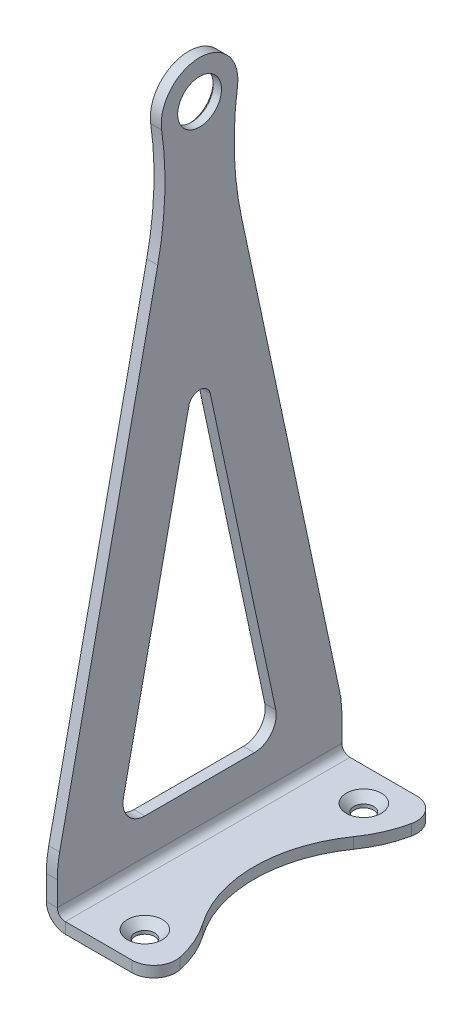
ISO-10303-21;
HEADER;
FILE_DESCRIPTION(('STEP AP214'),'2;1');
FILE_NAME('part.step','',(''),(''),'','','');
FILE_SCHEMA(('AUTOMOTIVE_DESIGN { 1 0 10303 214 1 1 1 1 }'));
ENDSEC;
DATA;
#1=APPLICATION_CONTEXT('core data for automotive mechanical design processes');
#2=APPLICATION_PROTOCOL_DEFINITION('international standard','automotive_design',2000,#1);
#3=PRODUCT_CONTEXT('',#1,'mechanical');
#4=PRODUCT('Part','Part','',(#3));
#5=PRODUCT_RELATED_PRODUCT_CATEGORY('part','',(#4));
#6=PRODUCT_DEFINITION_FORMATION('','',#4);
#7=PRODUCT_DEFINITION_CONTEXT('part definition',#1,'design');
#8=PRODUCT_DEFINITION('design','',#6,#7);
#9=PRODUCT_DEFINITION_SHAPE('','',#8);
#10=(LENGTH_UNIT() NAMED_UNIT(*) SI_UNIT(.MILLI.,.METRE.));
#11=(NAMED_UNIT(*) PLANE_ANGLE_UNIT() SI_UNIT($,.RADIAN.));
#12=(NAMED_UNIT(*) SI_UNIT($,.STERADIAN.) SOLID_ANGLE_UNIT());
#13=UNCERTAINTY_MEASURE_WITH_UNIT(LENGTH_MEASURE(1.E-05),#10,'distance_accuracy_value','');
#14=(GEOMETRIC_REPRESENTATION_CONTEXT(3) GLOBAL_UNCERTAINTY_ASSIGNED_CONTEXT((#13)) GLOBAL_UNIT_ASSIGNED_CONTEXT((#10,
#11,#12)) REPRESENTATION_CONTEXT('',''));
#15=CARTESIAN_POINT('',(0.,0.,0.));
#16=DIRECTION('',(0.,0.,1.));
#17=DIRECTION('',(1.,0.,0.));
#18=AXIS2_PLACEMENT_3D('',#15,#16,#17);
#19=CARTESIAN_POINT('',(1.,-40.,13.));
#20=DIRECTION('',(0.,0.,1.));
#21=DIRECTION('',(0.,-1.,0.));
#22=AXIS2_PLACEMENT_3D('',#19,#20,#21);
#23=PLANE('',#22);
#24=DIRECTION('',(0.,-1.,0.));
#25=VECTOR('',#24,1.);
#26=CARTESIAN_POINT('',(1.,-40.,13.));
#27=LINE('',#26,#25);
#28=CARTESIAN_POINT('',(1.,-36.0555416597179,13.));
#29=VERTEX_POINT('',#28);
#30=CARTESIAN_POINT('',(1.,-38.2634,13.));
#31=VERTEX_POINT('',#30);
#32=EDGE_CURVE('E337',#29,#31,#27,.T.);
#33=ORIENTED_EDGE('',*,*,#32,.F.);
#34=DIRECTION('',(-1.,0.,0.));
#35=VECTOR('',#34,1.);
#36=CARTESIAN_POINT('',(1.,-36.0555416597179,13.));
#37=LINE('',#36,#35);
#38=CARTESIAN_POINT('',(0.,-36.0555416597179,13.));
#39=VERTEX_POINT('',#38);
#40=EDGE_CURVE('E364',#29,#39,#37,.T.);
#41=ORIENTED_EDGE('',*,*,#40,.T.);
#42=DIRECTION('',(0.,-1.,0.));
#43=VECTOR('',#42,1.);
#44=CARTESIAN_POINT('',(0.,-40.,13.));
#45=LINE('',#44,#43);
#46=CARTESIAN_POINT('',(0.,-38.2634,13.));
#47=VERTEX_POINT('',#46);
#48=EDGE_CURVE('E317',#39,#47,#45,.T.);
#49=ORIENTED_EDGE('',*,*,#48,.T.);
#50=DIRECTION('',(-1.,0.,0.));
#51=VECTOR('',#50,1.);
#52=CARTESIAN_POINT('',(1.,-38.2634,13.));
#53=LINE('',#52,#51);
#54=EDGE_CURVE('E242',#31,#47,#53,.T.);
#55=ORIENTED_EDGE('',*,*,#54,.F.);
#56=EDGE_LOOP('',(#33,#41,#49,#55));
#57=FACE_BOUND('',#56,.T.);
#58=ADVANCED_FACE('F43',(#57),#23,.T.);
#59=CARTESIAN_POINT('',(1.,-36.0555416597179,-3.));
#60=DIRECTION('',(-1.,0.,0.));
#61=DIRECTION('',(0.,0.,-1.));
#62=AXIS2_PLACEMENT_3D('',#59,#60,#61);
#63=PLANE('',#62);
#64=DIRECTION('',(0.,0.,-1.));
#65=VECTOR('',#64,1.);
#66=CARTESIAN_POINT('',(1.,-35.,4.99999999999999));
#67=LINE('',#66,#65);
#68=CARTESIAN_POINT('',(1.,-35.,4.99999999999999));
#69=VERTEX_POINT('',#68);
#70=CARTESIAN_POINT('',(1.,-35.,-5.00000000000001));
#71=VERTEX_POINT('',#70);
#72=EDGE_CURVE('E281',#69,#71,#67,.T.);
#73=ORIENTED_EDGE('',*,*,#72,.F.);
#74=CARTESIAN_POINT('',(1.,-33.,4.99999999999999));
#75=DIRECTION('',(1.,0.,0.));
#76=DIRECTION('',(0.,0.,-1.));
#77=AXIS2_PLACEMENT_3D('',#74,#75,#76);
#78=CIRCLE('',#77,2.);
#79=CARTESIAN_POINT('',(1.,-32.5824357046866,6.95592434906859));
#80=VERTEX_POINT('',#79);
#81=EDGE_CURVE('E278',#80,#69,#78,.T.);
#82=ORIENTED_EDGE('',*,*,#81,.F.);
#83=DIRECTION('',(0.,-0.977962174534297,0.208782147656711));
#84=VECTOR('',#83,1.);
#85=CARTESIAN_POINT('',(1.,-4.58089939946607,0.977962174534313));
#86=LINE('',#85,#84);
#87=CARTESIAN_POINT('',(1.,-4.58089939946607,0.977962174534313));
#88=VERTEX_POINT('',#87);
#89=EDGE_CURVE('E275',#88,#80,#86,.T.);
#90=ORIENTED_EDGE('',*,*,#89,.F.);
#91=CARTESIAN_POINT('',(1.,-4.78968154712271,0.));
#92=DIRECTION('',(1.,0.,0.));
#93=DIRECTION('',(0.,0.,1.));
#94=AXIS2_PLACEMENT_3D('',#91,#92,#93);
#95=CIRCLE('',#94,1.);
#96=CARTESIAN_POINT('',(1.,-4.58089939946607,-0.977962174534315));
#97=VERTEX_POINT('',#96);
#98=EDGE_CURVE('E272',#97,#88,#95,.T.);
#99=ORIENTED_EDGE('',*,*,#98,.F.);
#100=DIRECTION('',(0.,0.977962174534297,0.208782147656712));
#101=VECTOR('',#100,1.);
#102=CARTESIAN_POINT('',(1.,-32.5824357046866,-6.9559243490686));
#103=LINE('',#102,#101);
#104=CARTESIAN_POINT('',(1.,-32.5824357046866,-6.9559243490686));
#105=VERTEX_POINT('',#104);
#106=EDGE_CURVE('E268',#105,#97,#103,.T.);
#107=ORIENTED_EDGE('',*,*,#106,.F.);
#108=CARTESIAN_POINT('',(1.,-33.,-5.00000000000001));
#109=DIRECTION('',(1.,0.,0.));
#110=DIRECTION('',(0.,0.,-1.));
#111=AXIS2_PLACEMENT_3D('',#108,#109,#110);
#112=CIRCLE('',#111,2.);
#113=EDGE_CURVE('E265',#71,#105,#112,.T.);
#114=ORIENTED_EDGE('',*,*,#113,.F.);
#115=EDGE_LOOP('',(#73,#82,#90,#99,#107,#114));
#116=FACE_BOUND('',#115,.T.);
#117=CARTESIAN_POINT('',(1.,19.,0.));
#118=DIRECTION('',(1.,0.,0.));
#119=DIRECTION('',(0.,0.,-1.));
#120=AXIS2_PLACEMENT_3D('',#117,#118,#119);
#121=CIRCLE('',#120,2.);
#122=CARTESIAN_POINT('',(1.,19.,-2.));
#123=VERTEX_POINT('',#122);
#124=EDGE_CURVE('E260',#123,#123,#121,.T.);
#125=ORIENTED_EDGE('',*,*,#124,.F.);
#126=EDGE_LOOP('',(#125));
#127=FACE_BOUND('',#126,.T.);
#128=DIRECTION('',(0.,0.,1.));
#129=VECTOR('',#128,1.);
#130=CARTESIAN_POINT('',(1.,-38.2634,13.));
#131=LINE('',#130,#129);
#132=CARTESIAN_POINT('',(1.,-38.2634,-13.));
#133=VERTEX_POINT('',#132);
#134=EDGE_CURVE('E249',#31,#133,#131,.F.);
#135=ORIENTED_EDGE('',*,*,#134,.T.);
#136=DIRECTION('',(0.,1.,0.));
#137=VECTOR('',#136,1.);
#138=CARTESIAN_POINT('',(1.,-40.,-13.));
#139=LINE('',#138,#137);
#140=CARTESIAN_POINT('',(1.,-36.0555416597179,-13.));
#141=VERTEX_POINT('',#140);
#142=EDGE_CURVE('E313',#133,#141,#139,.T.);
#143=ORIENTED_EDGE('',*,*,#142,.T.);
#144=CARTESIAN_POINT('',(1.,-36.0555416597179,-3.));
#145=DIRECTION('',(1.,0.,0.));
#146=DIRECTION('',(0.,0.,-1.));
#147=AXIS2_PLACEMENT_3D('',#144,#145,#146);
#148=CIRCLE('',#147,10.);
#149=CARTESIAN_POINT('',(1.,-33.9677201831507,-12.779621745343));
#150=VERTEX_POINT('',#149);
#151=EDGE_CURVE('E316',#141,#150,#148,.T.);
#152=ORIENTED_EDGE('',*,*,#151,.T.);
#153=DIRECTION('',(0.,0.977962174534297,0.208782147656711));
#154=VECTOR('',#153,1.);
#155=CARTESIAN_POINT('',(1.,-33.9677201831507,-12.779621745343));
#156=LINE('',#155,#154);
#157=CARTESIAN_POINT('',(1.,7.98727856402757,-3.82277763473949));
#158=VERTEX_POINT('',#157);
#159=EDGE_CURVE('E320',#150,#158,#156,.T.);
#160=ORIENTED_EDGE('',*,*,#159,.T.);
#161=CARTESIAN_POINT('',(1.,14.2507429937289,-33.1616428707684));
#162=DIRECTION('',(-1.,0.,0.));
#163=DIRECTION('',(0.,0.,1.));
#164=AXIS2_PLACEMENT_3D('',#161,#162,#163);
#165=CIRCLE('',#164,30.);
#166=CARTESIAN_POINT('',(1.,18.5038089694941,-3.46464925515491));
#167=VERTEX_POINT('',#166);
#168=EDGE_CURVE('E323',#158,#167,#165,.T.);
#169=ORIENTED_EDGE('',*,*,#168,.T.);
#170=CARTESIAN_POINT('',(1.,19.,0.));
#171=DIRECTION('',(1.,0.,0.));
#172=DIRECTION('',(0.,0.,1.));
#173=AXIS2_PLACEMENT_3D('',#170,#171,#172);
#174=CIRCLE('',#173,3.5);
#175=CARTESIAN_POINT('',(1.,18.5038089694941,3.46464925515491));
#176=VERTEX_POINT('',#175);
#177=EDGE_CURVE('E326',#167,#176,#174,.T.);
#178=ORIENTED_EDGE('',*,*,#177,.T.);
#179=CARTESIAN_POINT('',(1.,14.2507429937289,33.1616428707684));
#180=DIRECTION('',(-1.,0.,0.));
#181=DIRECTION('',(0.,0.,-1.));
#182=AXIS2_PLACEMENT_3D('',#179,#180,#181);
#183=CIRCLE('',#182,30.);
#184=CARTESIAN_POINT('',(1.,7.98727856402759,3.82277763473949));
#185=VERTEX_POINT('',#184);
#186=EDGE_CURVE('E329',#176,#185,#183,.T.);
#187=ORIENTED_EDGE('',*,*,#186,.T.);
#188=DIRECTION('',(0.,-0.977962174534297,0.20878214765671));
#189=VECTOR('',#188,1.);
#190=CARTESIAN_POINT('',(1.,-33.9677201831507,12.779621745343));
#191=LINE('',#190,#189);
#192=CARTESIAN_POINT('',(1.,-33.9677201831507,12.779621745343));
#193=VERTEX_POINT('',#192);
#194=EDGE_CURVE('E332',#185,#193,#191,.T.);
#195=ORIENTED_EDGE('',*,*,#194,.T.);
#196=CARTESIAN_POINT('',(1.,-36.0555416597179,2.99999999999999));
#197=DIRECTION('',(1.,0.,0.));
#198=DIRECTION('',(0.,0.,1.));
#199=AXIS2_PLACEMENT_3D('',#196,#197,#198);
#200=CIRCLE('',#199,10.);
#201=EDGE_CURVE('E335',#193,#29,#200,.T.);
#202=ORIENTED_EDGE('',*,*,#201,.T.);
#203=ORIENTED_EDGE('',*,*,#32,.T.);
#204=EDGE_LOOP('',(#135,#143,#152,#160,#169,#178,#187,#195,#202,#203));
#205=FACE_BOUND('',#204,.T.);
#206=ADVANCED_FACE('F419',(#116,#127,#205),#63,.F.);
#207=CARTESIAN_POINT('',(0.,-36.0555416597179,-3.));
#208=DIRECTION('',(-1.,0.,0.));
#209=DIRECTION('',(0.,0.,-1.));
#210=AXIS2_PLACEMENT_3D('',#207,#208,#209);
#211=PLANE('',#210);
#212=CARTESIAN_POINT('',(0.,19.,0.));
#213=DIRECTION('',(1.,0.,0.));
#214=DIRECTION('',(0.,0.,-1.));
#215=AXIS2_PLACEMENT_3D('',#212,#213,#214);
#216=CIRCLE('',#215,2.25000000000001);
#217=CARTESIAN_POINT('',(0.,19.,-2.25000000000001));
#218=VERTEX_POINT('',#217);
#219=EDGE_CURVE('E11',#218,#218,#216,.F.);
#220=ORIENTED_EDGE('',*,*,#219,.F.);
#221=EDGE_LOOP('',(#220));
#222=FACE_BOUND('',#221,.T.);
#223=CARTESIAN_POINT('',(0.,-33.,-5.00000000000001));
#224=DIRECTION('',(1.,0.,0.));
#225=DIRECTION('',(0.,0.,-1.));
#226=AXIS2_PLACEMENT_3D('',#223,#224,#225);
#227=CIRCLE('',#226,2.);
#228=CARTESIAN_POINT('',(0.,-35.,-5.00000000000001));
#229=VERTEX_POINT('',#228);
#230=CARTESIAN_POINT('',(0.,-32.5824357046866,-6.9559243490686));
#231=VERTEX_POINT('',#230);
#232=EDGE_CURVE('E264',#229,#231,#227,.T.);
#233=ORIENTED_EDGE('',*,*,#232,.T.);
#234=DIRECTION('',(0.,0.977962174534297,0.208782147656712));
#235=VECTOR('',#234,1.);
#236=CARTESIAN_POINT('',(0.,-32.5824357046866,-6.9559243490686));
#237=LINE('',#236,#235);
#238=CARTESIAN_POINT('',(0.,-4.58089939946607,-0.977962174534315));
#239=VERTEX_POINT('',#238);
#240=EDGE_CURVE('E287',#231,#239,#237,.T.);
#241=ORIENTED_EDGE('',*,*,#240,.T.);
#242=CARTESIAN_POINT('',(0.,-4.78968154712271,0.));
#243=DIRECTION('',(1.,0.,0.));
#244=DIRECTION('',(0.,0.,1.));
#245=AXIS2_PLACEMENT_3D('',#242,#243,#244);
#246=CIRCLE('',#245,1.);
#247=CARTESIAN_POINT('',(0.,-4.58089939946607,0.977962174534313));
#248=VERTEX_POINT('',#247);
#249=EDGE_CURVE('E290',#239,#248,#246,.T.);
#250=ORIENTED_EDGE('',*,*,#249,.T.);
#251=DIRECTION('',(0.,-0.977962174534297,0.208782147656711));
#252=VECTOR('',#251,1.);
#253=CARTESIAN_POINT('',(0.,-4.58089939946607,0.977962174534313));
#254=LINE('',#253,#252);
#255=CARTESIAN_POINT('',(0.,-32.5824357046866,6.95592434906859));
#256=VERTEX_POINT('',#255);
#257=EDGE_CURVE('E293',#248,#256,#254,.T.);
#258=ORIENTED_EDGE('',*,*,#257,.T.);
#259=CARTESIAN_POINT('',(0.,-33.,4.99999999999999));
#260=DIRECTION('',(1.,0.,0.));
#261=DIRECTION('',(0.,0.,-1.));
#262=AXIS2_PLACEMENT_3D('',#259,#260,#261);
#263=CIRCLE('',#262,2.);
#264=CARTESIAN_POINT('',(0.,-35.,4.99999999999999));
#265=VERTEX_POINT('',#264);
#266=EDGE_CURVE('E296',#256,#265,#263,.T.);
#267=ORIENTED_EDGE('',*,*,#266,.T.);
#268=DIRECTION('',(0.,0.,-1.));
#269=VECTOR('',#268,1.);
#270=CARTESIAN_POINT('',(0.,-35.,4.99999999999999));
#271=LINE('',#270,#269);
#272=EDGE_CURVE('E269',#265,#229,#271,.T.);
#273=ORIENTED_EDGE('',*,*,#272,.T.);
#274=EDGE_LOOP('',(#233,#241,#250,#258,#267,#273));
#275=FACE_BOUND('',#274,.T.);
#276=ORIENTED_EDGE('',*,*,#48,.F.);
#277=CARTESIAN_POINT('',(0.,-36.0555416597179,2.99999999999999));
#278=DIRECTION('',(1.,0.,0.));
#279=DIRECTION('',(0.,0.,1.));
#280=AXIS2_PLACEMENT_3D('',#277,#278,#279);
#281=CIRCLE('',#280,10.);
#282=CARTESIAN_POINT('',(0.,-33.9677201831507,12.779621745343));
#283=VERTEX_POINT('',#282);
#284=EDGE_CURVE('E361',#283,#39,#281,.T.);
#285=ORIENTED_EDGE('',*,*,#284,.F.);
#286=DIRECTION('',(0.,-0.977962174534297,0.20878214765671));
#287=VECTOR('',#286,1.);
#288=CARTESIAN_POINT('',(0.,-33.9677201831507,12.779621745343));
#289=LINE('',#288,#287);
#290=CARTESIAN_POINT('',(0.,7.98727856402759,3.82277763473949));
#291=VERTEX_POINT('',#290);
#292=EDGE_CURVE('E358',#291,#283,#289,.T.);
#293=ORIENTED_EDGE('',*,*,#292,.F.);
#294=CARTESIAN_POINT('',(0.,14.2507429937289,33.1616428707684));
#295=DIRECTION('',(-1.,0.,0.));
#296=DIRECTION('',(0.,0.,-1.));
#297=AXIS2_PLACEMENT_3D('',#294,#295,#296);
#298=CIRCLE('',#297,30.);
#299=CARTESIAN_POINT('',(0.,18.5038089694941,3.46464925515491));
#300=VERTEX_POINT('',#299);
#301=EDGE_CURVE('E355',#300,#291,#298,.T.);
#302=ORIENTED_EDGE('',*,*,#301,.F.);
#303=CARTESIAN_POINT('',(0.,19.,0.));
#304=DIRECTION('',(1.,0.,0.));
#305=DIRECTION('',(0.,0.,1.));
#306=AXIS2_PLACEMENT_3D('',#303,#304,#305);
#307=CIRCLE('',#306,3.5);
#308=CARTESIAN_POINT('',(0.,18.5038089694941,-3.46464925515491));
#309=VERTEX_POINT('',#308);
#310=EDGE_CURVE('E352',#309,#300,#307,.T.);
#311=ORIENTED_EDGE('',*,*,#310,.F.);
#312=CARTESIAN_POINT('',(0.,14.2507429937289,-33.1616428707684));
#313=DIRECTION('',(-1.,0.,0.));
#314=DIRECTION('',(0.,0.,1.));
#315=AXIS2_PLACEMENT_3D('',#312,#313,#314);
#316=CIRCLE('',#315,30.);
#317=CARTESIAN_POINT('',(0.,7.98727856402757,-3.82277763473949));
#318=VERTEX_POINT('',#317);
#319=EDGE_CURVE('E349',#318,#309,#316,.T.);
#320=ORIENTED_EDGE('',*,*,#319,.F.);
#321=DIRECTION('',(0.,0.977962174534297,0.208782147656711));
#322=VECTOR('',#321,1.);
#323=CARTESIAN_POINT('',(0.,-33.9677201831507,-12.779621745343));
#324=LINE('',#323,#322);
#325=CARTESIAN_POINT('',(0.,-33.9677201831507,-12.779621745343));
#326=VERTEX_POINT('',#325);
#327=EDGE_CURVE('E346',#326,#318,#324,.T.);
#328=ORIENTED_EDGE('',*,*,#327,.F.);
#329=CARTESIAN_POINT('',(0.,-36.0555416597179,-3.));
#330=DIRECTION('',(1.,0.,0.));
#331=DIRECTION('',(0.,0.,-1.));
#332=AXIS2_PLACEMENT_3D('',#329,#330,#331);
#333=CIRCLE('',#332,10.);
#334=CARTESIAN_POINT('',(0.,-36.0555416597179,-13.));
#335=VERTEX_POINT('',#334);
#336=EDGE_CURVE('E343',#335,#326,#333,.T.);
#337=ORIENTED_EDGE('',*,*,#336,.F.);
#338=DIRECTION('',(0.,1.,0.));
#339=VECTOR('',#338,1.);
#340=CARTESIAN_POINT('',(0.,-40.,-13.));
#341=LINE('',#340,#339);
#342=CARTESIAN_POINT('',(0.,-38.2634,-13.));
#343=VERTEX_POINT('',#342);
#344=EDGE_CURVE('E303',#343,#335,#341,.T.);
#345=ORIENTED_EDGE('',*,*,#344,.F.);
#346=DIRECTION('',(0.,0.,1.));
#347=VECTOR('',#346,1.);
#348=CARTESIAN_POINT('',(0.,-38.2634,13.));
#349=LINE('',#348,#347);
#350=EDGE_CURVE('E244',#47,#343,#349,.F.);
#351=ORIENTED_EDGE('',*,*,#350,.F.);
#352=EDGE_LOOP('',(#276,#285,#293,#302,#311,#320,#328,#337,#345,#351));
#353=FACE_BOUND('',#352,.T.);
#354=ADVANCED_FACE('F422',(#222,#275,#353),#211,.T.);
#355=CARTESIAN_POINT('',(1.,-40.,-13.));
#356=DIRECTION('',(0.,0.,-1.));
#357=DIRECTION('',(0.,1.,0.));
#358=AXIS2_PLACEMENT_3D('',#355,#356,#357);
#359=PLANE('',#358);
#360=DIRECTION('',(-1.,0.,0.));
#361=VECTOR('',#360,1.);
#362=CARTESIAN_POINT('',(1.,-38.2634,-13.));
#363=LINE('',#362,#361);
#364=EDGE_CURVE('E257',#133,#343,#363,.T.);
#365=ORIENTED_EDGE('',*,*,#364,.T.);
#366=ORIENTED_EDGE('',*,*,#344,.T.);
#367=DIRECTION('',(-1.,0.,0.));
#368=VECTOR('',#367,1.);
#369=CARTESIAN_POINT('',(1.,-36.0555416597179,-13.));
#370=LINE('',#369,#368);
#371=EDGE_CURVE('E340',#141,#335,#370,.T.);
#372=ORIENTED_EDGE('',*,*,#371,.F.);
#373=ORIENTED_EDGE('',*,*,#142,.F.);
#374=EDGE_LOOP('',(#365,#366,#372,#373));
#375=FACE_BOUND('',#374,.T.);
#376=ADVANCED_FACE('F442',(#375),#359,.T.);
#377=CARTESIAN_POINT('',(1.,-36.0555416597179,2.99999999999999));
#378=DIRECTION('',(-1.,0.,0.));
#379=DIRECTION('',(0.,0.,-1.));
#380=AXIS2_PLACEMENT_3D('',#377,#378,#379);
#381=CYLINDRICAL_SURFACE('',#380,10.);
#382=ORIENTED_EDGE('',*,*,#284,.T.);
#383=ORIENTED_EDGE('',*,*,#40,.F.);
#384=ORIENTED_EDGE('',*,*,#201,.F.);
#385=DIRECTION('',(-1.,0.,0.));
#386=VECTOR('',#385,1.);
#387=CARTESIAN_POINT('',(1.,-33.9677201831507,12.779621745343));
#388=LINE('',#387,#386);
#389=EDGE_CURVE('E368',#193,#283,#388,.T.);
#390=ORIENTED_EDGE('',*,*,#389,.T.);
#391=EDGE_LOOP('',(#382,#383,#384,#390));
#392=FACE_BOUND('',#391,.T.);
#393=ADVANCED_FACE('F505',(#392),#381,.T.);
#394=CARTESIAN_POINT('',(1.,-33.9677201831507,12.779621745343));
#395=DIRECTION('',(0.,0.20878214765671,0.977962174534298));
#396=DIRECTION('',(0.,-0.977962174534297,0.20878214765671));
#397=AXIS2_PLACEMENT_3D('',#394,#395,#396);
#398=PLANE('',#397);
#399=ORIENTED_EDGE('',*,*,#292,.T.);
#400=ORIENTED_EDGE('',*,*,#389,.F.);
#401=ORIENTED_EDGE('',*,*,#194,.F.);
#402=DIRECTION('',(-1.,0.,0.));
#403=VECTOR('',#402,1.);
#404=CARTESIAN_POINT('',(1.,7.98727856402759,3.82277763473949));
#405=LINE('',#404,#403);
#406=EDGE_CURVE('E370',#185,#291,#405,.T.);
#407=ORIENTED_EDGE('',*,*,#406,.T.);
#408=EDGE_LOOP('',(#399,#400,#401,#407));
#409=FACE_BOUND('',#408,.T.);
#410=ADVANCED_FACE('F508',(#409),#398,.T.);
#411=CARTESIAN_POINT('',(1.,14.2507429937289,33.1616428707684));
#412=DIRECTION('',(-1.,0.,0.));
#413=DIRECTION('',(0.,0.,-1.));
#414=AXIS2_PLACEMENT_3D('',#411,#412,#413);
#415=CYLINDRICAL_SURFACE('',#414,30.);
#416=ORIENTED_EDGE('',*,*,#301,.T.);
#417=ORIENTED_EDGE('',*,*,#406,.F.);
#418=ORIENTED_EDGE('',*,*,#186,.F.);
#419=DIRECTION('',(-1.,0.,0.));
#420=VECTOR('',#419,1.);
#421=CARTESIAN_POINT('',(1.,18.5038089694941,3.46464925515491));
#422=LINE('',#421,#420);
#423=EDGE_CURVE('E372',#176,#300,#422,.T.);
#424=ORIENTED_EDGE('',*,*,#423,.T.);
#425=EDGE_LOOP('',(#416,#417,#418,#424));
#426=FACE_BOUND('',#425,.T.);
#427=ADVANCED_FACE('F512',(#426),#415,.F.);
#428=CARTESIAN_POINT('',(1.,19.,0.));
#429=DIRECTION('',(-1.,0.,0.));
#430=DIRECTION('',(0.,0.,-1.));
#431=AXIS2_PLACEMENT_3D('',#428,#429,#430);
#432=CYLINDRICAL_SURFACE('',#431,3.5);
#433=ORIENTED_EDGE('',*,*,#310,.T.);
#434=ORIENTED_EDGE('',*,*,#423,.F.);
#435=ORIENTED_EDGE('',*,*,#177,.F.);
#436=DIRECTION('',(-1.,0.,0.));
#437=VECTOR('',#436,1.);
#438=CARTESIAN_POINT('',(1.,18.5038089694941,-3.46464925515491));
#439=LINE('',#438,#437);
#440=EDGE_CURVE('E374',#167,#309,#439,.T.);
#441=ORIENTED_EDGE('',*,*,#440,.T.);
#442=EDGE_LOOP('',(#433,#434,#435,#441));
#443=FACE_BOUND('',#442,.T.);
#444=ADVANCED_FACE('F516',(#443),#432,.T.);
#445=CARTESIAN_POINT('',(1.,14.2507429937289,-33.1616428707684));
#446=DIRECTION('',(-1.,0.,0.));
#447=DIRECTION('',(0.,0.,-1.));
#448=AXIS2_PLACEMENT_3D('',#445,#446,#447);
#449=CYLINDRICAL_SURFACE('',#448,30.);
#450=ORIENTED_EDGE('',*,*,#319,.T.);
#451=ORIENTED_EDGE('',*,*,#440,.F.);
#452=ORIENTED_EDGE('',*,*,#168,.F.);
#453=DIRECTION('',(-1.,0.,0.));
#454=VECTOR('',#453,1.);
#455=CARTESIAN_POINT('',(1.,7.98727856402757,-3.82277763473949));
#456=LINE('',#455,#454);
#457=EDGE_CURVE('E376',#158,#318,#456,.T.);
#458=ORIENTED_EDGE('',*,*,#457,.T.);
#459=EDGE_LOOP('',(#450,#451,#452,#458));
#460=FACE_BOUND('',#459,.T.);
#461=ADVANCED_FACE('F520',(#460),#449,.F.);
#462=CARTESIAN_POINT('',(1.,-33.9677201831507,-12.779621745343));
#463=DIRECTION('',(0.,0.208782147656711,-0.977962174534297));
#464=DIRECTION('',(0.,0.977962174534297,0.208782147656711));
#465=AXIS2_PLACEMENT_3D('',#462,#463,#464);
#466=PLANE('',#465);
#467=ORIENTED_EDGE('',*,*,#327,.T.);
#468=ORIENTED_EDGE('',*,*,#457,.F.);
#469=ORIENTED_EDGE('',*,*,#159,.F.);
#470=DIRECTION('',(-1.,0.,0.));
#471=VECTOR('',#470,1.);
#472=CARTESIAN_POINT('',(1.,-33.9677201831507,-12.779621745343));
#473=LINE('',#472,#471);
#474=EDGE_CURVE('E378',#150,#326,#473,.T.);
#475=ORIENTED_EDGE('',*,*,#474,.T.);
#476=EDGE_LOOP('',(#467,#468,#469,#475));
#477=FACE_BOUND('',#476,.T.);
#478=ADVANCED_FACE('F524',(#477),#466,.T.);
#479=CARTESIAN_POINT('',(1.,-36.0555416597179,-3.));
#480=DIRECTION('',(-1.,0.,0.));
#481=DIRECTION('',(0.,0.,-1.));
#482=AXIS2_PLACEMENT_3D('',#479,#480,#481);
#483=CYLINDRICAL_SURFACE('',#482,10.);
#484=ORIENTED_EDGE('',*,*,#336,.T.);
#485=ORIENTED_EDGE('',*,*,#474,.F.);
#486=ORIENTED_EDGE('',*,*,#151,.F.);
#487=ORIENTED_EDGE('',*,*,#371,.T.);
#488=EDGE_LOOP('',(#484,#485,#486,#487));
#489=FACE_BOUND('',#488,.T.);
#490=ADVANCED_FACE('F528',(#489),#483,.T.);
#491=CARTESIAN_POINT('',(1.,-33.,-5.00000000000001));
#492=DIRECTION('',(-1.,0.,0.));
#493=DIRECTION('',(0.,0.,-1.));
#494=AXIS2_PLACEMENT_3D('',#491,#492,#493);
#495=CYLINDRICAL_SURFACE('',#494,2.);
#496=ORIENTED_EDGE('',*,*,#232,.F.);
#497=DIRECTION('',(-1.,0.,0.));
#498=VECTOR('',#497,1.);
#499=CARTESIAN_POINT('',(1.,-35.,-5.00000000000001));
#500=LINE('',#499,#498);
#501=EDGE_CURVE('E301',#71,#229,#500,.T.);
#502=ORIENTED_EDGE('',*,*,#501,.F.);
#503=ORIENTED_EDGE('',*,*,#113,.T.);
#504=DIRECTION('',(-1.,0.,0.));
#505=VECTOR('',#504,1.);
#506=CARTESIAN_POINT('',(1.,-32.5824357046866,-6.9559243490686));
#507=LINE('',#506,#505);
#508=EDGE_CURVE('E284',#105,#231,#507,.T.);
#509=ORIENTED_EDGE('',*,*,#508,.T.);
#510=EDGE_LOOP('',(#496,#502,#503,#509));
#511=FACE_BOUND('',#510,.T.);
#512=ADVANCED_FACE('F532',(#511),#495,.F.);
#513=CARTESIAN_POINT('',(1.,-35.,4.99999999999999));
#514=DIRECTION('',(0.,-1.,0.));
#515=DIRECTION('',(0.,0.,-1.));
#516=AXIS2_PLACEMENT_3D('',#513,#514,#515);
#517=PLANE('',#516);
#518=ORIENTED_EDGE('',*,*,#272,.F.);
#519=DIRECTION('',(-1.,0.,0.));
#520=VECTOR('',#519,1.);
#521=CARTESIAN_POINT('',(1.,-35.,4.99999999999999));
#522=LINE('',#521,#520);
#523=EDGE_CURVE('E304',#69,#265,#522,.T.);
#524=ORIENTED_EDGE('',*,*,#523,.F.);
#525=ORIENTED_EDGE('',*,*,#72,.T.);
#526=ORIENTED_EDGE('',*,*,#501,.T.);
#527=EDGE_LOOP('',(#518,#524,#525,#526));
#528=FACE_BOUND('',#527,.T.);
#529=ADVANCED_FACE('F575',(#528),#517,.F.);
#530=CARTESIAN_POINT('',(1.,-33.,4.99999999999999));
#531=DIRECTION('',(-1.,0.,0.));
#532=DIRECTION('',(0.,0.,-1.));
#533=AXIS2_PLACEMENT_3D('',#530,#531,#532);
#534=CYLINDRICAL_SURFACE('',#533,2.);
#535=ORIENTED_EDGE('',*,*,#266,.F.);
#536=DIRECTION('',(-1.,0.,0.));
#537=VECTOR('',#536,1.);
#538=CARTESIAN_POINT('',(1.,-32.5824357046866,6.95592434906859));
#539=LINE('',#538,#537);
#540=EDGE_CURVE('E306',#80,#256,#539,.T.);
#541=ORIENTED_EDGE('',*,*,#540,.F.);
#542=ORIENTED_EDGE('',*,*,#81,.T.);
#543=ORIENTED_EDGE('',*,*,#523,.T.);
#544=EDGE_LOOP('',(#535,#541,#542,#543));
#545=FACE_BOUND('',#544,.T.);
#546=ADVANCED_FACE('F572',(#545),#534,.F.);
#547=CARTESIAN_POINT('',(1.,-4.58089939946607,0.977962174534313));
#548=DIRECTION('',(0.,0.208782147656711,0.977962174534297));
#549=DIRECTION('',(0.,-0.977962174534297,0.208782147656711));
#550=AXIS2_PLACEMENT_3D('',#547,#548,#549);
#551=PLANE('',#550);
#552=ORIENTED_EDGE('',*,*,#257,.F.);
#553=DIRECTION('',(-1.,0.,0.));
#554=VECTOR('',#553,1.);
#555=CARTESIAN_POINT('',(1.,-4.58089939946607,0.977962174534313));
#556=LINE('',#555,#554);
#557=EDGE_CURVE('E308',#88,#248,#556,.T.);
#558=ORIENTED_EDGE('',*,*,#557,.F.);
#559=ORIENTED_EDGE('',*,*,#89,.T.);
#560=ORIENTED_EDGE('',*,*,#540,.T.);
#561=EDGE_LOOP('',(#552,#558,#559,#560));
#562=FACE_BOUND('',#561,.T.);
#563=ADVANCED_FACE('F568',(#562),#551,.F.);
#564=CARTESIAN_POINT('',(1.,-4.78968154712271,0.));
#565=DIRECTION('',(-1.,0.,0.));
#566=DIRECTION('',(0.,0.,-1.));
#567=AXIS2_PLACEMENT_3D('',#564,#565,#566);
#568=CYLINDRICAL_SURFACE('',#567,1.);
#569=ORIENTED_EDGE('',*,*,#249,.F.);
#570=DIRECTION('',(-1.,0.,0.));
#571=VECTOR('',#570,1.);
#572=CARTESIAN_POINT('',(1.,-4.58089939946607,-0.977962174534315));
#573=LINE('',#572,#571);
#574=EDGE_CURVE('E310',#97,#239,#573,.T.);
#575=ORIENTED_EDGE('',*,*,#574,.F.);
#576=ORIENTED_EDGE('',*,*,#98,.T.);
#577=ORIENTED_EDGE('',*,*,#557,.T.);
#578=EDGE_LOOP('',(#569,#575,#576,#577));
#579=FACE_BOUND('',#578,.T.);
#580=ADVANCED_FACE('F564',(#579),#568,.F.);
#581=CARTESIAN_POINT('',(1.,-32.5824357046866,-6.9559243490686));
#582=DIRECTION('',(0.,0.208782147656712,-0.977962174534297));
#583=DIRECTION('',(0.,0.977962174534297,0.208782147656712));
#584=AXIS2_PLACEMENT_3D('',#581,#582,#583);
#585=PLANE('',#584);
#586=ORIENTED_EDGE('',*,*,#240,.F.);
#587=ORIENTED_EDGE('',*,*,#508,.F.);
#588=ORIENTED_EDGE('',*,*,#106,.T.);
#589=ORIENTED_EDGE('',*,*,#574,.T.);
#590=EDGE_LOOP('',(#586,#587,#588,#589));
#591=FACE_BOUND('',#590,.T.);
#592=ADVANCED_FACE('F415',(#591),#585,.F.);
#593=CARTESIAN_POINT('',(1.,19.,0.));
#594=DIRECTION('',(-1.,0.,0.));
#595=DIRECTION('',(0.,0.,-1.));
#596=AXIS2_PLACEMENT_3D('',#593,#594,#595);
#597=CYLINDRICAL_SURFACE('',#596,2.);
#598=CARTESIAN_POINT('',(0.250000000000001,19.,0.));
#599=DIRECTION('',(1.,0.,0.));
#600=DIRECTION('',(0.,0.,-1.));
#601=AXIS2_PLACEMENT_3D('',#598,#599,#600);
#602=CIRCLE('',#601,2.);
#603=CARTESIAN_POINT('',(0.250000000000001,19.,-2.));
#604=VERTEX_POINT('',#603);
#605=EDGE_CURVE('E51',#604,#604,#602,.T.);
#606=ORIENTED_EDGE('',*,*,#605,.F.);
#607=EDGE_LOOP('',(#606));
#608=FACE_BOUND('',#607,.T.);
#609=ORIENTED_EDGE('',*,*,#124,.T.);
#610=EDGE_LOOP('',(#609));
#611=FACE_BOUND('',#610,.T.);
#612=ADVANCED_FACE('F411',(#608,#611),#597,.F.);
#613=CARTESIAN_POINT('',(1.7366,-38.2634,-13.));
#614=DIRECTION('',(0.,0.,-1.));
#615=DIRECTION('',(1.,0.,0.));
#616=AXIS2_PLACEMENT_3D('',#613,#614,#615);
#617=PLANE('',#616);
#618=DIRECTION('',(0.,1.,0.));
#619=VECTOR('',#618,1.);
#620=CARTESIAN_POINT('',(1.73659999999999,-40.,-13.));
#621=LINE('',#620,#619);
#622=CARTESIAN_POINT('',(1.7366,-39.,-13.));
#623=VERTEX_POINT('',#622);
#624=CARTESIAN_POINT('',(1.73659999999999,-40.,-13.));
#625=VERTEX_POINT('',#624);
#626=EDGE_CURVE('E446',#623,#625,#621,.F.);
#627=ORIENTED_EDGE('',*,*,#626,.T.);
#628=CARTESIAN_POINT('',(1.7366,-38.2634,-13.));
#629=DIRECTION('',(0.,0.,-1.));
#630=DIRECTION('',(-1.,0.,0.));
#631=AXIS2_PLACEMENT_3D('',#628,#629,#630);
#632=CIRCLE('',#631,1.7366);
#633=EDGE_CURVE('E226',#343,#625,#632,.F.);
#634=ORIENTED_EDGE('',*,*,#633,.F.);
#635=ORIENTED_EDGE('',*,*,#364,.F.);
#636=CARTESIAN_POINT('',(1.7366,-38.2634,-13.));
#637=DIRECTION('',(0.,0.,-1.));
#638=DIRECTION('',(-1.,0.,0.));
#639=AXIS2_PLACEMENT_3D('',#636,#637,#638);
#640=CIRCLE('',#639,0.736599999999997);
#641=EDGE_CURVE('E245',#133,#623,#640,.F.);
#642=ORIENTED_EDGE('',*,*,#641,.T.);
#643=EDGE_LOOP('',(#627,#634,#635,#642));
#644=FACE_BOUND('',#643,.T.);
#645=ADVANCED_FACE('F414',(#644),#617,.T.);
#646=CARTESIAN_POINT('',(1.7366,-38.2634,13.));
#647=DIRECTION('',(0.,0.,-1.));
#648=DIRECTION('',(1.,0.,0.));
#649=AXIS2_PLACEMENT_3D('',#646,#647,#648);
#650=PLANE('',#649);
#651=CARTESIAN_POINT('',(1.7366,-38.2634,13.));
#652=DIRECTION('',(0.,0.,-1.));
#653=DIRECTION('',(-1.,0.,0.));
#654=AXIS2_PLACEMENT_3D('',#651,#652,#653);
#655=CIRCLE('',#654,0.736599999999997);
#656=CARTESIAN_POINT('',(1.7366,-39.,13.));
#657=VERTEX_POINT('',#656);
#658=EDGE_CURVE('E255',#657,#31,#655,.T.);
#659=ORIENTED_EDGE('',*,*,#658,.T.);
#660=ORIENTED_EDGE('',*,*,#54,.T.);
#661=CARTESIAN_POINT('',(1.7366,-38.2634,13.));
#662=DIRECTION('',(0.,0.,-1.));
#663=DIRECTION('',(-1.,0.,0.));
#664=AXIS2_PLACEMENT_3D('',#661,#662,#663);
#665=CIRCLE('',#664,1.7366);
#666=CARTESIAN_POINT('',(1.73659999999999,-40.,13.));
#667=VERTEX_POINT('',#666);
#668=EDGE_CURVE('E224',#667,#47,#665,.T.);
#669=ORIENTED_EDGE('',*,*,#668,.F.);
#670=DIRECTION('',(0.,1.,0.));
#671=VECTOR('',#670,1.);
#672=CARTESIAN_POINT('',(1.7366,-39.,13.));
#673=LINE('',#672,#671);
#674=EDGE_CURVE('E229',#657,#667,#673,.F.);
#675=ORIENTED_EDGE('',*,*,#674,.F.);
#676=EDGE_LOOP('',(#659,#660,#669,#675));
#677=FACE_BOUND('',#676,.T.);
#678=ADVANCED_FACE('F240',(#677),#650,.F.);
#679=CARTESIAN_POINT('',(1.7366,-38.2634,13.));
#680=DIRECTION('',(0.,0.,1.));
#681=DIRECTION('',(0.,-1.,0.));
#682=AXIS2_PLACEMENT_3D('',#679,#680,#681);
#683=CYLINDRICAL_SURFACE('',#682,1.7366);
#684=ORIENTED_EDGE('',*,*,#350,.T.);
#685=ORIENTED_EDGE('',*,*,#633,.T.);
#686=DIRECTION('',(0.,0.,1.));
#687=VECTOR('',#686,1.);
#688=CARTESIAN_POINT('',(1.73659999999999,-40.,-13.));
#689=LINE('',#688,#687);
#690=EDGE_CURVE('E208',#667,#625,#689,.F.);
#691=ORIENTED_EDGE('',*,*,#690,.F.);
#692=ORIENTED_EDGE('',*,*,#668,.T.);
#693=EDGE_LOOP('',(#684,#685,#691,#692));
#694=FACE_BOUND('',#693,.T.);
#695=ADVANCED_FACE('F222',(#694),#683,.T.);
#696=CARTESIAN_POINT('',(1.7366,-38.2634,13.));
#697=DIRECTION('',(0.,0.,1.));
#698=DIRECTION('',(0.,-1.,0.));
#699=AXIS2_PLACEMENT_3D('',#696,#697,#698);
#700=CYLINDRICAL_SURFACE('',#699,0.736599999999997);
#701=ORIENTED_EDGE('',*,*,#134,.F.);
#702=ORIENTED_EDGE('',*,*,#658,.F.);
#703=DIRECTION('',(0.,0.,1.));
#704=VECTOR('',#703,1.);
#705=CARTESIAN_POINT('',(1.7366,-39.,-13.));
#706=LINE('',#705,#704);
#707=EDGE_CURVE('E237',#623,#657,#706,.T.);
#708=ORIENTED_EDGE('',*,*,#707,.F.);
#709=ORIENTED_EDGE('',*,*,#641,.F.);
#710=EDGE_LOOP('',(#701,#702,#708,#709));
#711=FACE_BOUND('',#710,.T.);
#712=ADVANCED_FACE('F429',(#711),#700,.F.);
#713=CARTESIAN_POINT('',(10.,-40.,13.));
#714=DIRECTION('',(0.,0.,-1.));
#715=DIRECTION('',(1.,0.,0.));
#716=AXIS2_PLACEMENT_3D('',#713,#714,#715);
#717=PLANE('',#716);
#718=DIRECTION('',(-1.,0.,0.));
#719=VECTOR('',#718,1.);
#720=CARTESIAN_POINT('',(10.,-39.,13.));
#721=LINE('',#720,#719);
#722=CARTESIAN_POINT('',(7.82818204277451,-39.,13.));
#723=VERTEX_POINT('',#722);
#724=EDGE_CURVE('E228',#657,#723,#721,.F.);
#725=ORIENTED_EDGE('',*,*,#724,.F.);
#726=ORIENTED_EDGE('',*,*,#674,.T.);
#727=DIRECTION('',(1.,0.,0.));
#728=VECTOR('',#727,1.);
#729=CARTESIAN_POINT('',(-1.57689123647893E-13,-40.,13.));
#730=LINE('',#729,#728);
#731=CARTESIAN_POINT('',(7.82818204277451,-40.,13.));
#732=VERTEX_POINT('',#731);
#733=EDGE_CURVE('E204',#667,#732,#730,.T.);
#734=ORIENTED_EDGE('',*,*,#733,.T.);
#735=DIRECTION('',(0.,-1.,0.));
#736=VECTOR('',#735,1.);
#737=CARTESIAN_POINT('',(7.82818204277451,-40.,13.));
#738=LINE('',#737,#736);
#739=EDGE_CURVE('E401',#723,#732,#738,.T.);
#740=ORIENTED_EDGE('',*,*,#739,.F.);
#741=EDGE_LOOP('',(#725,#726,#734,#740));
#742=FACE_BOUND('',#741,.T.);
#743=ADVANCED_FACE('F232',(#742),#717,.F.);
#744=CARTESIAN_POINT('',(0.999999999999997,-40.,-13.));
#745=DIRECTION('',(0.,0.,1.));
#746=DIRECTION('',(-1.,0.,0.));
#747=AXIS2_PLACEMENT_3D('',#744,#745,#746);
#748=PLANE('',#747);
#749=DIRECTION('',(-1.,0.,0.));
#750=VECTOR('',#749,1.);
#751=CARTESIAN_POINT('',(-1.57689123647893E-13,-40.,-13.));
#752=LINE('',#751,#750);
#753=CARTESIAN_POINT('',(7.82818204277451,-40.,-13.));
#754=VERTEX_POINT('',#753);
#755=EDGE_CURVE('E217',#754,#625,#752,.T.);
#756=ORIENTED_EDGE('',*,*,#755,.T.);
#757=ORIENTED_EDGE('',*,*,#626,.F.);
#758=DIRECTION('',(1.,0.,0.));
#759=VECTOR('',#758,1.);
#760=CARTESIAN_POINT('',(1.,-39.,-13.));
#761=LINE('',#760,#759);
#762=CARTESIAN_POINT('',(7.82818204277452,-39.,-13.));
#763=VERTEX_POINT('',#762);
#764=EDGE_CURVE('E218',#763,#623,#761,.F.);
#765=ORIENTED_EDGE('',*,*,#764,.F.);
#766=DIRECTION('',(0.,-1.,0.));
#767=VECTOR('',#766,1.);
#768=CARTESIAN_POINT('',(7.82818204277452,-39.,-13.));
#769=LINE('',#768,#767);
#770=EDGE_CURVE('E405',#754,#763,#769,.F.);
#771=ORIENTED_EDGE('',*,*,#770,.F.);
#772=EDGE_LOOP('',(#756,#757,#765,#771));
#773=FACE_BOUND('',#772,.T.);
#774=ADVANCED_FACE('F628',(#773),#748,.F.);
#775=CARTESIAN_POINT('',(-1.57689123647893E-13,-40.,0.));
#776=DIRECTION('',(0.,1.,0.));
#777=DIRECTION('',(1.,0.,0.));
#778=AXIS2_PLACEMENT_3D('',#775,#776,#777);
#779=PLANE('',#778);
#780=CARTESIAN_POINT('',(6.00000000000001,-40.0000000000001,-10.));
#781=DIRECTION('',(0.,-1.,0.));
#782=DIRECTION('',(0.,0.,1.));
#783=AXIS2_PLACEMENT_3D('',#780,#781,#782);
#784=CIRCLE('',#783,0.9);
#785=CARTESIAN_POINT('',(6.00000000000001,-40.0000000000001,-9.1));
#786=VERTEX_POINT('',#785);
#787=EDGE_CURVE('E470',#786,#786,#784,.T.);
#788=ORIENTED_EDGE('',*,*,#787,.F.);
#789=EDGE_LOOP('',(#788));
#790=FACE_BOUND('',#789,.T.);
#791=CARTESIAN_POINT('',(6.,-40.0000000000001,9.99999999999999));
#792=DIRECTION('',(0.,-1.,0.));
#793=DIRECTION('',(0.,0.,1.));
#794=AXIS2_PLACEMENT_3D('',#791,#792,#793);
#795=CIRCLE('',#794,0.9);
#796=CARTESIAN_POINT('',(6.,-40.0000000000001,10.9));
#797=VERTEX_POINT('',#796);
#798=EDGE_CURVE('E460',#797,#797,#795,.T.);
#799=ORIENTED_EDGE('',*,*,#798,.F.);
#800=EDGE_LOOP('',(#799));
#801=FACE_BOUND('',#800,.T.);
#802=ORIENTED_EDGE('',*,*,#733,.F.);
#803=ORIENTED_EDGE('',*,*,#690,.T.);
#804=ORIENTED_EDGE('',*,*,#755,.F.);
#805=CARTESIAN_POINT('',(7.82818204277451,-40.,-11.));
#806=DIRECTION('',(0.,-1.,0.));
#807=DIRECTION('',(1.,0.,0.));
#808=AXIS2_PLACEMENT_3D('',#805,#806,#807);
#809=CIRCLE('',#808,2.);
#810=CARTESIAN_POINT('',(9.78522755346814,-40.,-10.5877223398316));
#811=VERTEX_POINT('',#810);
#812=EDGE_CURVE('E58',#811,#754,#809,.F.);
#813=ORIENTED_EDGE('',*,*,#812,.F.);
#814=CARTESIAN_POINT('',(0.,-40.,-12.6491106406735));
#815=DIRECTION('',(0.,-1.,0.));
#816=DIRECTION('',(1.,0.,0.));
#817=AXIS2_PLACEMENT_3D('',#814,#815,#816);
#818=CIRCLE('',#817,10.);
#819=CARTESIAN_POINT('',(8.18181818181818,-40.,-6.89951489491283));
#820=VERTEX_POINT('',#819);
#821=EDGE_CURVE('E393',#820,#811,#818,.F.);
#822=ORIENTED_EDGE('',*,*,#821,.F.);
#823=CARTESIAN_POINT('',(18.,-40.0000000000001,0.));
#824=DIRECTION('',(0.,-1.,0.));
#825=DIRECTION('',(1.,0.,0.));
#826=AXIS2_PLACEMENT_3D('',#823,#824,#825);
#827=CIRCLE('',#826,12.);
#828=CARTESIAN_POINT('',(8.18181818181818,-40.,6.89951489491283));
#829=VERTEX_POINT('',#828);
#830=EDGE_CURVE('E449',#829,#820,#827,.T.);
#831=ORIENTED_EDGE('',*,*,#830,.F.);
#832=CARTESIAN_POINT('',(0.,-40.,12.6491106406735));
#833=DIRECTION('',(0.,-1.,0.));
#834=DIRECTION('',(1.,0.,0.));
#835=AXIS2_PLACEMENT_3D('',#832,#833,#834);
#836=CIRCLE('',#835,10.);
#837=CARTESIAN_POINT('',(9.78522755346814,-40.,10.5877223398316));
#838=VERTEX_POINT('',#837);
#839=EDGE_CURVE('E390',#838,#829,#836,.F.);
#840=ORIENTED_EDGE('',*,*,#839,.F.);
#841=CARTESIAN_POINT('',(7.82818204277451,-40.,11.));
#842=DIRECTION('',(0.,-1.,0.));
#843=DIRECTION('',(1.,0.,0.));
#844=AXIS2_PLACEMENT_3D('',#841,#842,#843);
#845=CIRCLE('',#844,2.);
#846=EDGE_CURVE('E212',#732,#838,#845,.F.);
#847=ORIENTED_EDGE('',*,*,#846,.F.);
#848=EDGE_LOOP('',(#802,#803,#804,#813,#822,#831,#840,#847));
#849=FACE_BOUND('',#848,.T.);
#850=ADVANCED_FACE('F206',(#790,#801,#849),#779,.F.);
#851=CARTESIAN_POINT('',(-1.54197642309049E-13,-39.,0.));
#852=DIRECTION('',(0.,1.,0.));
#853=DIRECTION('',(1.,0.,0.));
#854=AXIS2_PLACEMENT_3D('',#851,#852,#853);
#855=PLANE('',#854);
#856=CARTESIAN_POINT('',(6.00000000000001,-39.,-10.));
#857=DIRECTION('',(0.,-1.,0.));
#858=DIRECTION('',(0.,0.,1.));
#859=AXIS2_PLACEMENT_3D('',#856,#857,#858);
#860=CIRCLE('',#859,1.6);
#861=CARTESIAN_POINT('',(6.00000000000001,-39.,-8.4));
#862=VERTEX_POINT('',#861);
#863=EDGE_CURVE('E476',#862,#862,#860,.T.);
#864=ORIENTED_EDGE('',*,*,#863,.T.);
#865=EDGE_LOOP('',(#864));
#866=FACE_BOUND('',#865,.T.);
#867=CARTESIAN_POINT('',(6.,-39.,9.99999999999999));
#868=DIRECTION('',(0.,-1.,0.));
#869=DIRECTION('',(0.,0.,1.));
#870=AXIS2_PLACEMENT_3D('',#867,#868,#869);
#871=CIRCLE('',#870,1.6);
#872=CARTESIAN_POINT('',(6.,-39.,11.6));
#873=VERTEX_POINT('',#872);
#874=EDGE_CURVE('E467',#873,#873,#871,.T.);
#875=ORIENTED_EDGE('',*,*,#874,.T.);
#876=EDGE_LOOP('',(#875));
#877=FACE_BOUND('',#876,.T.);
#878=CARTESIAN_POINT('',(0.,-39.,12.6491106406735));
#879=DIRECTION('',(0.,-1.,0.));
#880=DIRECTION('',(1.,0.,0.));
#881=AXIS2_PLACEMENT_3D('',#878,#879,#880);
#882=CIRCLE('',#881,10.);
#883=CARTESIAN_POINT('',(8.18181818181818,-39.,6.89951489491283));
#884=VERTEX_POINT('',#883);
#885=CARTESIAN_POINT('',(9.78522755346814,-39.,10.5877223398316));
#886=VERTEX_POINT('',#885);
#887=EDGE_CURVE('E367',#884,#886,#882,.T.);
#888=ORIENTED_EDGE('',*,*,#887,.F.);
#889=CARTESIAN_POINT('',(18.,-39.0000000000001,0.));
#890=DIRECTION('',(0.,-1.,0.));
#891=DIRECTION('',(1.,0.,0.));
#892=AXIS2_PLACEMENT_3D('',#889,#890,#891);
#893=CIRCLE('',#892,12.);
#894=CARTESIAN_POINT('',(8.18181818181818,-39.,-6.89951489491283));
#895=VERTEX_POINT('',#894);
#896=EDGE_CURVE('E453',#884,#895,#893,.T.);
#897=ORIENTED_EDGE('',*,*,#896,.T.);
#898=CARTESIAN_POINT('',(0.,-39.,-12.6491106406735));
#899=DIRECTION('',(0.,-1.,0.));
#900=DIRECTION('',(1.,0.,0.));
#901=AXIS2_PLACEMENT_3D('',#898,#899,#900);
#902=CIRCLE('',#901,10.);
#903=CARTESIAN_POINT('',(9.78522755346815,-39.,-10.5877223398316));
#904=VERTEX_POINT('',#903);
#905=EDGE_CURVE('E383',#904,#895,#902,.T.);
#906=ORIENTED_EDGE('',*,*,#905,.F.);
#907=CARTESIAN_POINT('',(7.82818204277452,-39.,-11.));
#908=DIRECTION('',(0.,-1.,0.));
#909=DIRECTION('',(1.,0.,0.));
#910=AXIS2_PLACEMENT_3D('',#907,#908,#909);
#911=CIRCLE('',#910,2.);
#912=EDGE_CURVE('E397',#763,#904,#911,.T.);
#913=ORIENTED_EDGE('',*,*,#912,.F.);
#914=ORIENTED_EDGE('',*,*,#764,.T.);
#915=ORIENTED_EDGE('',*,*,#707,.T.);
#916=ORIENTED_EDGE('',*,*,#724,.T.);
#917=CARTESIAN_POINT('',(7.82818204277451,-39.,11.));
#918=DIRECTION('',(0.,-1.,0.));
#919=DIRECTION('',(1.,0.,0.));
#920=AXIS2_PLACEMENT_3D('',#917,#918,#919);
#921=CIRCLE('',#920,2.);
#922=EDGE_CURVE('E399',#886,#723,#921,.T.);
#923=ORIENTED_EDGE('',*,*,#922,.F.);
#924=EDGE_LOOP('',(#888,#897,#906,#913,#914,#915,#916,#923));
#925=FACE_BOUND('',#924,.T.);
#926=ADVANCED_FACE('F480',(#866,#877,#925),#855,.T.);
#927=CARTESIAN_POINT('',(18.,-40.0000000000001,0.));
#928=DIRECTION('',(0.,1.,0.));
#929=DIRECTION('',(1.,0.,0.));
#930=AXIS2_PLACEMENT_3D('',#927,#928,#929);
#931=CYLINDRICAL_SURFACE('',#930,12.);
#932=ORIENTED_EDGE('',*,*,#896,.F.);
#933=DIRECTION('',(0.,1.,0.));
#934=VECTOR('',#933,1.);
#935=CARTESIAN_POINT('',(8.18181818181818,-40.,6.89951489491283));
#936=LINE('',#935,#934);
#937=EDGE_CURVE('E386',#829,#884,#936,.T.);
#938=ORIENTED_EDGE('',*,*,#937,.F.);
#939=ORIENTED_EDGE('',*,*,#830,.T.);
#940=DIRECTION('',(0.,1.,0.));
#941=VECTOR('',#940,1.);
#942=CARTESIAN_POINT('',(8.18181818181818,-40.,-6.89951489491283));
#943=LINE('',#942,#941);
#944=EDGE_CURVE('E388',#895,#820,#943,.F.);
#945=ORIENTED_EDGE('',*,*,#944,.F.);
#946=EDGE_LOOP('',(#932,#938,#939,#945));
#947=FACE_BOUND('',#946,.T.);
#948=ADVANCED_FACE('F648',(#947),#931,.F.);
#949=CARTESIAN_POINT('',(6.,-39.,9.99999999999999));
#950=DIRECTION('',(0.,1.,0.));
#951=DIRECTION('',(0.,0.,1.));
#952=AXIS2_PLACEMENT_3D('',#949,#950,#951);
#953=CYLINDRICAL_SURFACE('',#952,0.9);
#954=ORIENTED_EDGE('',*,*,#798,.T.);
#955=EDGE_LOOP('',(#954));
#956=FACE_BOUND('',#955,.T.);
#957=CARTESIAN_POINT('',(6.,-39.7,9.99999999999999));
#958=DIRECTION('',(0.,-1.,0.));
#959=DIRECTION('',(0.,0.,1.));
#960=AXIS2_PLACEMENT_3D('',#957,#958,#959);
#961=CIRCLE('',#960,0.9);
#962=CARTESIAN_POINT('',(6.,-39.7,10.9));
#963=VERTEX_POINT('',#962);
#964=EDGE_CURVE('E464',#963,#963,#961,.T.);
#965=ORIENTED_EDGE('',*,*,#964,.F.);
#966=EDGE_LOOP('',(#965));
#967=FACE_BOUND('',#966,.T.);
#968=ADVANCED_FACE('F655',(#956,#967),#953,.F.);
#969=CARTESIAN_POINT('',(6.,-39.,9.99999999999999));
#970=DIRECTION('',(0.,1.,0.));
#971=DIRECTION('',(0.,0.,1.));
#972=AXIS2_PLACEMENT_3D('',#969,#970,#971);
#973=CONICAL_SURFACE('',#972,1.6,0.785398163397449);
#974=ORIENTED_EDGE('',*,*,#964,.T.);
#975=EDGE_LOOP('',(#974));
#976=FACE_BOUND('',#975,.T.);
#977=ORIENTED_EDGE('',*,*,#874,.F.);
#978=EDGE_LOOP('',(#977));
#979=FACE_BOUND('',#978,.T.);
#980=ADVANCED_FACE('F496',(#976,#979),#973,.F.);
#981=CARTESIAN_POINT('',(6.00000000000001,-39.,-10.));
#982=DIRECTION('',(0.,1.,0.));
#983=DIRECTION('',(0.,0.,1.));
#984=AXIS2_PLACEMENT_3D('',#981,#982,#983);
#985=CYLINDRICAL_SURFACE('',#984,0.9);
#986=ORIENTED_EDGE('',*,*,#787,.T.);
#987=EDGE_LOOP('',(#986));
#988=FACE_BOUND('',#987,.T.);
#989=CARTESIAN_POINT('',(6.00000000000001,-39.7,-10.));
#990=DIRECTION('',(0.,-1.,0.));
#991=DIRECTION('',(0.,0.,1.));
#992=AXIS2_PLACEMENT_3D('',#989,#990,#991);
#993=CIRCLE('',#992,0.9);
#994=CARTESIAN_POINT('',(6.00000000000001,-39.7,-9.1));
#995=VERTEX_POINT('',#994);
#996=EDGE_CURVE('E473',#995,#995,#993,.T.);
#997=ORIENTED_EDGE('',*,*,#996,.F.);
#998=EDGE_LOOP('',(#997));
#999=FACE_BOUND('',#998,.T.);
#1000=ADVANCED_FACE('F486',(#988,#999),#985,.F.);
#1001=CARTESIAN_POINT('',(6.00000000000001,-39.,-10.));
#1002=DIRECTION('',(0.,1.,0.));
#1003=DIRECTION('',(0.,0.,1.));
#1004=AXIS2_PLACEMENT_3D('',#1001,#1002,#1003);
#1005=CONICAL_SURFACE('',#1004,1.6,0.785398163397449);
#1006=ORIENTED_EDGE('',*,*,#996,.T.);
#1007=EDGE_LOOP('',(#1006));
#1008=FACE_BOUND('',#1007,.T.);
#1009=ORIENTED_EDGE('',*,*,#863,.F.);
#1010=EDGE_LOOP('',(#1009));
#1011=FACE_BOUND('',#1010,.T.);
#1012=ADVANCED_FACE('F483',(#1008,#1011),#1005,.F.);
#1013=CARTESIAN_POINT('',(0.,-40.,-12.6491106406735));
#1014=DIRECTION('',(0.,1.,0.));
#1015=DIRECTION('',(1.,0.,0.));
#1016=AXIS2_PLACEMENT_3D('',#1013,#1014,#1015);
#1017=CYLINDRICAL_SURFACE('',#1016,10.);
#1018=ORIENTED_EDGE('',*,*,#905,.T.);
#1019=ORIENTED_EDGE('',*,*,#944,.T.);
#1020=ORIENTED_EDGE('',*,*,#821,.T.);
#1021=DIRECTION('',(0.,1.,0.));
#1022=VECTOR('',#1021,1.);
#1023=CARTESIAN_POINT('',(9.78522755346814,-40.,-10.5877223398316));
#1024=LINE('',#1023,#1022);
#1025=EDGE_CURVE('E63',#904,#811,#1024,.F.);
#1026=ORIENTED_EDGE('',*,*,#1025,.F.);
#1027=EDGE_LOOP('',(#1018,#1019,#1020,#1026));
#1028=FACE_BOUND('',#1027,.T.);
#1029=ADVANCED_FACE('F485',(#1028),#1017,.T.);
#1030=CARTESIAN_POINT('',(0.,-40.,12.6491106406735));
#1031=DIRECTION('',(0.,1.,0.));
#1032=DIRECTION('',(1.,0.,0.));
#1033=AXIS2_PLACEMENT_3D('',#1030,#1031,#1032);
#1034=CYLINDRICAL_SURFACE('',#1033,10.);
#1035=ORIENTED_EDGE('',*,*,#839,.T.);
#1036=ORIENTED_EDGE('',*,*,#937,.T.);
#1037=ORIENTED_EDGE('',*,*,#887,.T.);
#1038=DIRECTION('',(0.,1.,0.));
#1039=VECTOR('',#1038,1.);
#1040=CARTESIAN_POINT('',(9.78522755346814,-40.,10.5877223398316));
#1041=LINE('',#1040,#1039);
#1042=EDGE_CURVE('E395',#838,#886,#1041,.T.);
#1043=ORIENTED_EDGE('',*,*,#1042,.F.);
#1044=EDGE_LOOP('',(#1035,#1036,#1037,#1043));
#1045=FACE_BOUND('',#1044,.T.);
#1046=ADVANCED_FACE('F493',(#1045),#1034,.T.);
#1047=CARTESIAN_POINT('',(7.82818204277451,-40.,11.));
#1048=DIRECTION('',(0.,1.,0.));
#1049=DIRECTION('',(1.,0.,0.));
#1050=AXIS2_PLACEMENT_3D('',#1047,#1048,#1049);
#1051=CYLINDRICAL_SURFACE('',#1050,2.);
#1052=ORIENTED_EDGE('',*,*,#846,.T.);
#1053=ORIENTED_EDGE('',*,*,#1042,.T.);
#1054=ORIENTED_EDGE('',*,*,#922,.T.);
#1055=ORIENTED_EDGE('',*,*,#739,.T.);
#1056=EDGE_LOOP('',(#1052,#1053,#1054,#1055));
#1057=FACE_BOUND('',#1056,.T.);
#1058=ADVANCED_FACE('F538',(#1057),#1051,.T.);
#1059=CARTESIAN_POINT('',(7.82818204277451,-40.,-11.));
#1060=DIRECTION('',(0.,1.,0.));
#1061=DIRECTION('',(1.,0.,0.));
#1062=AXIS2_PLACEMENT_3D('',#1059,#1060,#1061);
#1063=CYLINDRICAL_SURFACE('',#1062,2.);
#1064=ORIENTED_EDGE('',*,*,#812,.T.);
#1065=ORIENTED_EDGE('',*,*,#770,.T.);
#1066=ORIENTED_EDGE('',*,*,#912,.T.);
#1067=ORIENTED_EDGE('',*,*,#1025,.T.);
#1068=EDGE_LOOP('',(#1064,#1065,#1066,#1067));
#1069=FACE_BOUND('',#1068,.T.);
#1070=ADVANCED_FACE('F541',(#1069),#1063,.T.);
#1071=CARTESIAN_POINT('',(0.250000000000001,19.,0.));
#1072=DIRECTION('',(-1.,0.,0.));
#1073=DIRECTION('',(0.,0.,-1.));
#1074=AXIS2_PLACEMENT_3D('',#1071,#1072,#1073);
#1075=CONICAL_SURFACE('',#1074,2.,0.785398163397462);
#1076=ORIENTED_EDGE('',*,*,#219,.T.);
#1077=EDGE_LOOP('',(#1076));
#1078=FACE_BOUND('',#1077,.T.);
#1079=ORIENTED_EDGE('',*,*,#605,.T.);
#1080=EDGE_LOOP('',(#1079));
#1081=FACE_BOUND('',#1080,.T.);
#1082=ADVANCED_FACE('F45',(#1078,#1081),#1075,.F.);
#1083=CLOSED_SHELL('',(#58,#206,#354,#376,#393,#410,#427,#444,#461,#478,#490,#512,#529,#546,
#563,#580,#592,#612,#645,#678,#695,#712,#743,#774,#850,#926,#948,#968,#980,#1000,#1012,#1029,
#1046,#1058,#1070,#1082));
#1084=MANIFOLD_SOLID_BREP('B2',#1083);
#1085=ADVANCED_BREP_SHAPE_REPRESENTATION('',(#18,#1084),#14);
#1086=SHAPE_DEFINITION_REPRESENTATION(#9,#1085);
ENDSEC;
END-ISO-10303-21;
